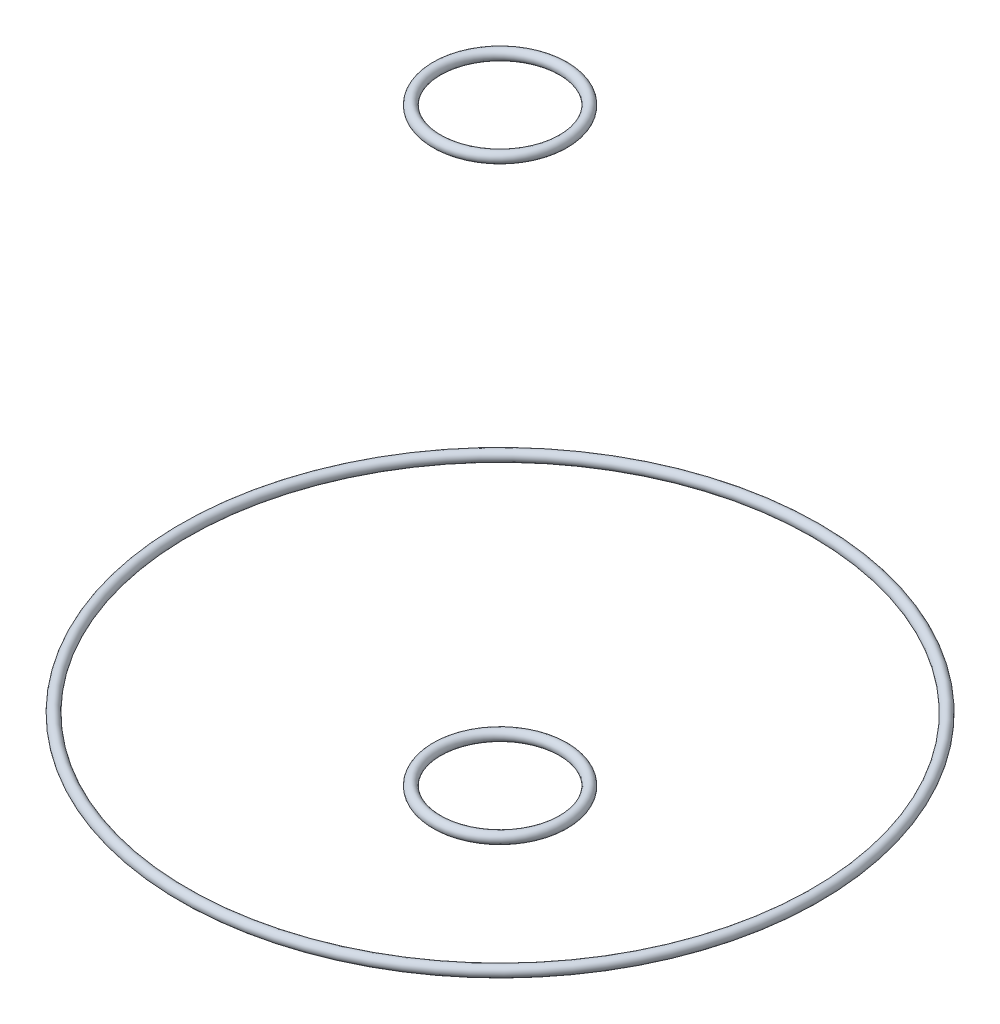
ISO-10303-21;
HEADER;
FILE_DESCRIPTION(('STEP AP214'),'2;1');
FILE_NAME('part.step','',(''),(''),'','','');
FILE_SCHEMA(('AUTOMOTIVE_DESIGN { 1 0 10303 214 1 1 1 1 }'));
ENDSEC;
DATA;
#1=APPLICATION_CONTEXT('core data for automotive mechanical design processes');
#2=APPLICATION_PROTOCOL_DEFINITION('international standard','automotive_design',2000,#1);
#3=PRODUCT_CONTEXT('',#1,'mechanical');
#4=PRODUCT('Part','Part','',(#3));
#5=PRODUCT_RELATED_PRODUCT_CATEGORY('part','',(#4));
#6=PRODUCT_DEFINITION_FORMATION('','',#4);
#7=PRODUCT_DEFINITION_CONTEXT('part definition',#1,'design');
#8=PRODUCT_DEFINITION('design','',#6,#7);
#9=PRODUCT_DEFINITION_SHAPE('','',#8);
#10=(LENGTH_UNIT() NAMED_UNIT(*) SI_UNIT(.MILLI.,.METRE.));
#11=(NAMED_UNIT(*) PLANE_ANGLE_UNIT() SI_UNIT($,.RADIAN.));
#12=(NAMED_UNIT(*) SI_UNIT($,.STERADIAN.) SOLID_ANGLE_UNIT());
#13=UNCERTAINTY_MEASURE_WITH_UNIT(LENGTH_MEASURE(1.E-05),#10,'distance_accuracy_value','');
#14=(GEOMETRIC_REPRESENTATION_CONTEXT(3) GLOBAL_UNCERTAINTY_ASSIGNED_CONTEXT((#13)) GLOBAL_UNIT_ASSIGNED_CONTEXT((#10,
#11,#12)) REPRESENTATION_CONTEXT('',''));
#15=CARTESIAN_POINT('',(0.,0.,0.));
#16=DIRECTION('',(0.,0.,1.));
#17=DIRECTION('',(1.,0.,0.));
#18=AXIS2_PLACEMENT_3D('',#15,#16,#17);
#19=CARTESIAN_POINT('',(0.,1270.,0.));
#20=DIRECTION('',(0.,-1.,0.));
#21=DIRECTION('',(0.,0.,-1.));
#22=AXIS2_PLACEMENT_3D('',#19,#20,#21);
#23=TOROIDAL_SURFACE('',#22,152.4,12.7);
#24=CARTESIAN_POINT('',(0.,1270.,-165.1));
#25=VERTEX_POINT('',#24);
#26=VERTEX_LOOP('',#25);
#27=FACE_BOUND('',#26,.T.);
#28=ADVANCED_FACE('F35',(#27),#23,.T.);
#29=CLOSED_SHELL('',(#28));
#30=MANIFOLD_SOLID_BREP('B2',#29);
#31=CARTESIAN_POINT('',(0.,-152.4,0.));
#32=DIRECTION('',(0.,-1.,0.));
#33=DIRECTION('',(0.,0.,-1.));
#34=AXIS2_PLACEMENT_3D('',#31,#32,#33);
#35=TOROIDAL_SURFACE('',#34,152.4,12.7);
#36=CARTESIAN_POINT('',(0.,-152.4,-165.1));
#37=VERTEX_POINT('',#36);
#38=VERTEX_LOOP('',#37);
#39=FACE_BOUND('',#38,.T.);
#40=ADVANCED_FACE('F52',(#39),#35,.T.);
#41=CLOSED_SHELL('',(#40));
#42=MANIFOLD_SOLID_BREP('B6',#41);
#43=CARTESIAN_POINT('',(0.,0.,0.));
#44=DIRECTION('',(0.,-1.,0.));
#45=DIRECTION('',(0.,0.,-1.));
#46=AXIS2_PLACEMENT_3D('',#43,#44,#45);
#47=TOROIDAL_SURFACE('',#46,762.,12.7);
#48=CARTESIAN_POINT('',(0.,0.,-774.7));
#49=VERTEX_POINT('',#48);
#50=VERTEX_LOOP('',#49);
#51=FACE_BOUND('',#50,.T.);
#52=ADVANCED_FACE('F64',(#51),#47,.T.);
#53=CLOSED_SHELL('',(#52));
#54=MANIFOLD_SOLID_BREP('B31',#53);
#55=ADVANCED_BREP_SHAPE_REPRESENTATION('',(#18,#30,#42,#54),#14);
#56=SHAPE_DEFINITION_REPRESENTATION(#9,#55);
ENDSEC;
END-ISO-10303-21;
